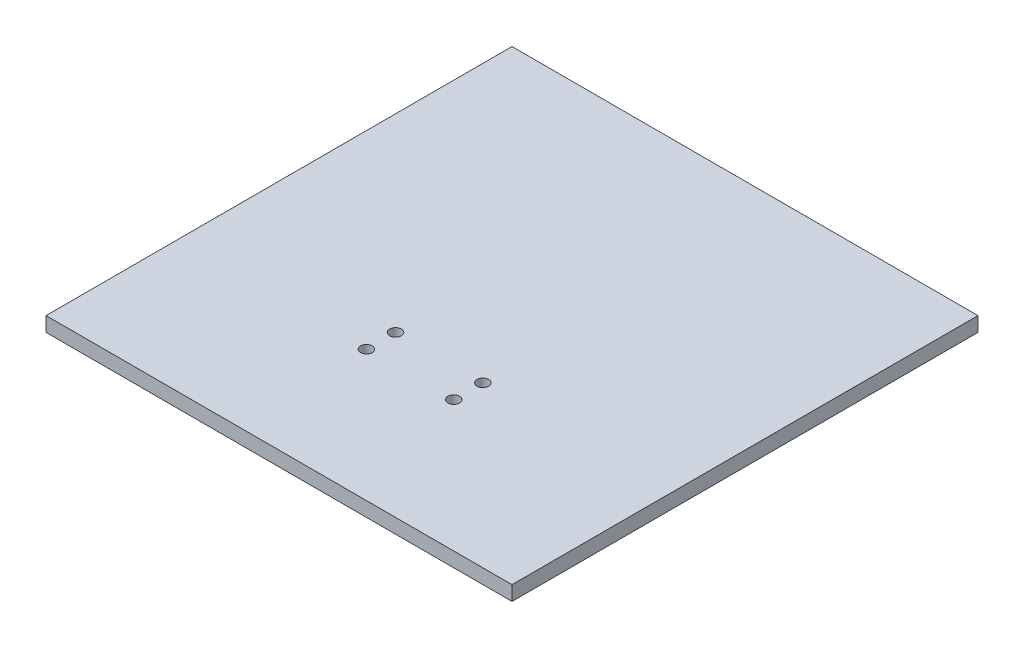
ISO-10303-21;
HEADER;
FILE_DESCRIPTION(('STEP AP214'),'2;1');
FILE_NAME('part.step','',(''),(''),'','','');
FILE_SCHEMA(('AUTOMOTIVE_DESIGN { 1 0 10303 214 1 1 1 1 }'));
ENDSEC;
DATA;
#1=APPLICATION_CONTEXT('core data for automotive mechanical design processes');
#2=APPLICATION_PROTOCOL_DEFINITION('international standard','automotive_design',2000,#1);
#3=PRODUCT_CONTEXT('',#1,'mechanical');
#4=PRODUCT('Part','Part','',(#3));
#5=PRODUCT_RELATED_PRODUCT_CATEGORY('part','',(#4));
#6=PRODUCT_DEFINITION_FORMATION('','',#4);
#7=PRODUCT_DEFINITION_CONTEXT('part definition',#1,'design');
#8=PRODUCT_DEFINITION('design','',#6,#7);
#9=PRODUCT_DEFINITION_SHAPE('','',#8);
#10=(LENGTH_UNIT() NAMED_UNIT(*) SI_UNIT(.MILLI.,.METRE.));
#11=(NAMED_UNIT(*) PLANE_ANGLE_UNIT() SI_UNIT($,.RADIAN.));
#12=(NAMED_UNIT(*) SI_UNIT($,.STERADIAN.) SOLID_ANGLE_UNIT());
#13=UNCERTAINTY_MEASURE_WITH_UNIT(LENGTH_MEASURE(1.E-05),#10,'distance_accuracy_value','');
#14=(GEOMETRIC_REPRESENTATION_CONTEXT(3) GLOBAL_UNCERTAINTY_ASSIGNED_CONTEXT((#13)) GLOBAL_UNIT_ASSIGNED_CONTEXT((#10,
#11,#12)) REPRESENTATION_CONTEXT('',''));
#15=CARTESIAN_POINT('',(0.,0.,0.));
#16=DIRECTION('',(0.,0.,1.));
#17=DIRECTION('',(1.,0.,0.));
#18=AXIS2_PLACEMENT_3D('',#15,#16,#17);
#19=CARTESIAN_POINT('',(0.,6.35,0.));
#20=DIRECTION('',(1.,0.,0.));
#21=DIRECTION('',(0.,0.,-1.));
#22=AXIS2_PLACEMENT_3D('',#19,#20,#21);
#23=PLANE('',#22);
#24=DIRECTION('',(0.,0.,1.));
#25=VECTOR('',#24,1.);
#26=CARTESIAN_POINT('',(0.,0.,0.));
#27=LINE('',#26,#25);
#28=CARTESIAN_POINT('',(0.,0.,-203.2));
#29=VERTEX_POINT('',#28);
#30=CARTESIAN_POINT('',(0.,0.,0.));
#31=VERTEX_POINT('',#30);
#32=EDGE_CURVE('E95',#29,#31,#27,.T.);
#33=ORIENTED_EDGE('',*,*,#32,.T.);
#34=DIRECTION('',(0.,-1.,0.));
#35=VECTOR('',#34,1.);
#36=CARTESIAN_POINT('',(0.,6.35,0.));
#37=LINE('',#36,#35);
#38=CARTESIAN_POINT('',(0.,6.35,0.));
#39=VERTEX_POINT('',#38);
#40=EDGE_CURVE('E11',#39,#31,#37,.T.);
#41=ORIENTED_EDGE('',*,*,#40,.F.);
#42=DIRECTION('',(0.,0.,1.));
#43=VECTOR('',#42,1.);
#44=CARTESIAN_POINT('',(0.,6.35,0.));
#45=LINE('',#44,#43);
#46=CARTESIAN_POINT('',(0.,6.35,-203.2));
#47=VERTEX_POINT('',#46);
#48=EDGE_CURVE('E83',#47,#39,#45,.T.);
#49=ORIENTED_EDGE('',*,*,#48,.F.);
#50=DIRECTION('',(0.,-1.,0.));
#51=VECTOR('',#50,1.);
#52=CARTESIAN_POINT('',(0.,6.35,-203.2));
#53=LINE('',#52,#51);
#54=EDGE_CURVE('E91',#47,#29,#53,.T.);
#55=ORIENTED_EDGE('',*,*,#54,.T.);
#56=EDGE_LOOP('',(#33,#41,#49,#55));
#57=FACE_BOUND('',#56,.T.);
#58=ADVANCED_FACE('F32',(#57),#23,.F.);
#59=CARTESIAN_POINT('',(0.,6.35,0.));
#60=DIRECTION('',(0.,0.,-1.));
#61=DIRECTION('',(-1.,0.,0.));
#62=AXIS2_PLACEMENT_3D('',#59,#60,#61);
#63=PLANE('',#62);
#64=DIRECTION('',(1.,0.,0.));
#65=VECTOR('',#64,1.);
#66=CARTESIAN_POINT('',(0.,0.,0.));
#67=LINE('',#66,#65);
#68=CARTESIAN_POINT('',(203.2,0.,0.));
#69=VERTEX_POINT('',#68);
#70=EDGE_CURVE('E87',#31,#69,#67,.T.);
#71=ORIENTED_EDGE('',*,*,#70,.T.);
#72=DIRECTION('',(0.,-1.,0.));
#73=VECTOR('',#72,1.);
#74=CARTESIAN_POINT('',(203.2,6.35,0.));
#75=LINE('',#74,#73);
#76=CARTESIAN_POINT('',(203.2,6.35,0.));
#77=VERTEX_POINT('',#76);
#78=EDGE_CURVE('E40',#77,#69,#75,.T.);
#79=ORIENTED_EDGE('',*,*,#78,.F.);
#80=DIRECTION('',(1.,0.,0.));
#81=VECTOR('',#80,1.);
#82=CARTESIAN_POINT('',(0.,6.35,0.));
#83=LINE('',#82,#81);
#84=EDGE_CURVE('E78',#39,#77,#83,.T.);
#85=ORIENTED_EDGE('',*,*,#84,.F.);
#86=ORIENTED_EDGE('',*,*,#40,.T.);
#87=EDGE_LOOP('',(#71,#79,#85,#86));
#88=FACE_BOUND('',#87,.T.);
#89=ADVANCED_FACE('F86',(#88),#63,.F.);
#90=CARTESIAN_POINT('',(203.2,6.35,0.));
#91=DIRECTION('',(-1.,0.,0.));
#92=DIRECTION('',(0.,0.,1.));
#93=AXIS2_PLACEMENT_3D('',#90,#91,#92);
#94=PLANE('',#93);
#95=DIRECTION('',(0.,0.,-1.));
#96=VECTOR('',#95,1.);
#97=CARTESIAN_POINT('',(203.2,0.,0.));
#98=LINE('',#97,#96);
#99=CARTESIAN_POINT('',(203.2,0.,-203.2));
#100=VERTEX_POINT('',#99);
#101=EDGE_CURVE('E65',#69,#100,#98,.T.);
#102=ORIENTED_EDGE('',*,*,#101,.T.);
#103=DIRECTION('',(0.,-1.,0.));
#104=VECTOR('',#103,1.);
#105=CARTESIAN_POINT('',(203.2,6.35,-203.2));
#106=LINE('',#105,#104);
#107=CARTESIAN_POINT('',(203.2,6.35,-203.2));
#108=VERTEX_POINT('',#107);
#109=EDGE_CURVE('E88',#108,#100,#106,.T.);
#110=ORIENTED_EDGE('',*,*,#109,.F.);
#111=DIRECTION('',(0.,0.,-1.));
#112=VECTOR('',#111,1.);
#113=CARTESIAN_POINT('',(203.2,6.35,0.));
#114=LINE('',#113,#112);
#115=EDGE_CURVE('E81',#77,#108,#114,.T.);
#116=ORIENTED_EDGE('',*,*,#115,.F.);
#117=ORIENTED_EDGE('',*,*,#78,.T.);
#118=EDGE_LOOP('',(#102,#110,#116,#117));
#119=FACE_BOUND('',#118,.T.);
#120=ADVANCED_FACE('F89',(#119),#94,.F.);
#121=CARTESIAN_POINT('',(0.,6.35,-203.2));
#122=DIRECTION('',(0.,0.,1.));
#123=DIRECTION('',(1.,0.,0.));
#124=AXIS2_PLACEMENT_3D('',#121,#122,#123);
#125=PLANE('',#124);
#126=DIRECTION('',(-1.,0.,0.));
#127=VECTOR('',#126,1.);
#128=CARTESIAN_POINT('',(0.,0.,-203.2));
#129=LINE('',#128,#127);
#130=EDGE_CURVE('E71',#100,#29,#129,.T.);
#131=ORIENTED_EDGE('',*,*,#130,.T.);
#132=ORIENTED_EDGE('',*,*,#54,.F.);
#133=DIRECTION('',(-1.,0.,0.));
#134=VECTOR('',#133,1.);
#135=CARTESIAN_POINT('',(0.,6.35,-203.2));
#136=LINE('',#135,#134);
#137=EDGE_CURVE('E48',#108,#47,#136,.T.);
#138=ORIENTED_EDGE('',*,*,#137,.F.);
#139=ORIENTED_EDGE('',*,*,#109,.T.);
#140=EDGE_LOOP('',(#131,#132,#138,#139));
#141=FACE_BOUND('',#140,.T.);
#142=ADVANCED_FACE('F103',(#141),#125,.F.);
#143=CARTESIAN_POINT('',(0.,6.35,0.));
#144=DIRECTION('',(0.,-1.,0.));
#145=DIRECTION('',(0.,0.,-1.));
#146=AXIS2_PLACEMENT_3D('',#143,#144,#145);
#147=PLANE('',#146);
#148=CARTESIAN_POINT('',(82.55,6.35,-57.15));
#149=DIRECTION('',(0.,-1.,0.));
#150=DIRECTION('',(0.,0.,-1.));
#151=AXIS2_PLACEMENT_3D('',#148,#149,#150);
#152=CIRCLE('',#151,2.55269999999999);
#153=CARTESIAN_POINT('',(82.55,6.35,-59.7027));
#154=VERTEX_POINT('',#153);
#155=EDGE_CURVE('E135',#154,#154,#152,.T.);
#156=ORIENTED_EDGE('',*,*,#155,.T.);
#157=EDGE_LOOP('',(#156));
#158=FACE_BOUND('',#157,.T.);
#159=CARTESIAN_POINT('',(82.55,6.35,-69.85));
#160=DIRECTION('',(0.,-1.,0.));
#161=DIRECTION('',(0.,0.,-1.));
#162=AXIS2_PLACEMENT_3D('',#159,#160,#161);
#163=CIRCLE('',#162,2.55269999999999);
#164=CARTESIAN_POINT('',(82.55,6.35,-72.4027));
#165=VERTEX_POINT('',#164);
#166=EDGE_CURVE('E126',#165,#165,#163,.T.);
#167=ORIENTED_EDGE('',*,*,#166,.T.);
#168=EDGE_LOOP('',(#167));
#169=FACE_BOUND('',#168,.T.);
#170=CARTESIAN_POINT('',(120.65,6.35,-57.15));
#171=DIRECTION('',(0.,-1.,0.));
#172=DIRECTION('',(0.,0.,-1.));
#173=AXIS2_PLACEMENT_3D('',#170,#171,#172);
#174=CIRCLE('',#173,2.55269999999999);
#175=CARTESIAN_POINT('',(120.65,6.35,-59.7027));
#176=VERTEX_POINT('',#175);
#177=EDGE_CURVE('E117',#176,#176,#174,.T.);
#178=ORIENTED_EDGE('',*,*,#177,.T.);
#179=EDGE_LOOP('',(#178));
#180=FACE_BOUND('',#179,.T.);
#181=CARTESIAN_POINT('',(120.65,6.35,-69.85));
#182=DIRECTION('',(0.,-1.,0.));
#183=DIRECTION('',(0.,0.,-1.));
#184=AXIS2_PLACEMENT_3D('',#181,#182,#183);
#185=CIRCLE('',#184,2.55269999999999);
#186=CARTESIAN_POINT('',(120.65,6.35,-72.4027));
#187=VERTEX_POINT('',#186);
#188=EDGE_CURVE('E98',#187,#187,#185,.T.);
#189=ORIENTED_EDGE('',*,*,#188,.T.);
#190=EDGE_LOOP('',(#189));
#191=FACE_BOUND('',#190,.T.);
#192=ORIENTED_EDGE('',*,*,#48,.T.);
#193=ORIENTED_EDGE('',*,*,#84,.T.);
#194=ORIENTED_EDGE('',*,*,#115,.T.);
#195=ORIENTED_EDGE('',*,*,#137,.T.);
#196=EDGE_LOOP('',(#192,#193,#194,#195));
#197=FACE_BOUND('',#196,.T.);
#198=ADVANCED_FACE('F79',(#158,#169,#180,#191,#197),#147,.F.);
#199=CARTESIAN_POINT('',(0.,0.,0.));
#200=DIRECTION('',(0.,-1.,0.));
#201=DIRECTION('',(0.,0.,-1.));
#202=AXIS2_PLACEMENT_3D('',#199,#200,#201);
#203=PLANE('',#202);
#204=CARTESIAN_POINT('',(82.55,0.,-57.15));
#205=DIRECTION('',(0.,-1.,0.));
#206=DIRECTION('',(0.,0.,-1.));
#207=AXIS2_PLACEMENT_3D('',#204,#205,#206);
#208=CIRCLE('',#207,4.88950000000001);
#209=CARTESIAN_POINT('',(82.55,0.,-62.0395000000001));
#210=VERTEX_POINT('',#209);
#211=EDGE_CURVE('E141',#210,#210,#208,.T.);
#212=ORIENTED_EDGE('',*,*,#211,.F.);
#213=EDGE_LOOP('',(#212));
#214=FACE_BOUND('',#213,.T.);
#215=CARTESIAN_POINT('',(82.55,0.,-69.85));
#216=DIRECTION('',(0.,-1.,0.));
#217=DIRECTION('',(0.,0.,-1.));
#218=AXIS2_PLACEMENT_3D('',#215,#216,#217);
#219=CIRCLE('',#218,4.88950000000001);
#220=CARTESIAN_POINT('',(82.55,0.,-74.7395));
#221=VERTEX_POINT('',#220);
#222=EDGE_CURVE('E132',#221,#221,#219,.T.);
#223=ORIENTED_EDGE('',*,*,#222,.F.);
#224=EDGE_LOOP('',(#223));
#225=FACE_BOUND('',#224,.T.);
#226=CARTESIAN_POINT('',(120.65,0.,-57.15));
#227=DIRECTION('',(0.,-1.,0.));
#228=DIRECTION('',(0.,0.,-1.));
#229=AXIS2_PLACEMENT_3D('',#226,#227,#228);
#230=CIRCLE('',#229,4.88949999999999);
#231=CARTESIAN_POINT('',(120.65,0.,-62.0395));
#232=VERTEX_POINT('',#231);
#233=EDGE_CURVE('E123',#232,#232,#230,.T.);
#234=ORIENTED_EDGE('',*,*,#233,.F.);
#235=EDGE_LOOP('',(#234));
#236=FACE_BOUND('',#235,.T.);
#237=CARTESIAN_POINT('',(120.65,0.,-69.85));
#238=DIRECTION('',(0.,-1.,0.));
#239=DIRECTION('',(0.,0.,-1.));
#240=AXIS2_PLACEMENT_3D('',#237,#238,#239);
#241=CIRCLE('',#240,4.88949999999999);
#242=CARTESIAN_POINT('',(120.65,0.,-74.7395));
#243=VERTEX_POINT('',#242);
#244=EDGE_CURVE('E114',#243,#243,#241,.T.);
#245=ORIENTED_EDGE('',*,*,#244,.F.);
#246=EDGE_LOOP('',(#245));
#247=FACE_BOUND('',#246,.T.);
#248=ORIENTED_EDGE('',*,*,#32,.F.);
#249=ORIENTED_EDGE('',*,*,#130,.F.);
#250=ORIENTED_EDGE('',*,*,#101,.F.);
#251=ORIENTED_EDGE('',*,*,#70,.F.);
#252=EDGE_LOOP('',(#248,#249,#250,#251));
#253=FACE_BOUND('',#252,.T.);
#254=ADVANCED_FACE('F106',(#214,#225,#236,#247,#253),#203,.T.);
#255=CARTESIAN_POINT('',(120.65,0.,-69.85));
#256=DIRECTION('',(0.,-1.,0.));
#257=DIRECTION('',(0.,0.,-1.));
#258=AXIS2_PLACEMENT_3D('',#255,#256,#257);
#259=CYLINDRICAL_SURFACE('',#258,2.5527);
#260=ORIENTED_EDGE('',*,*,#188,.F.);
#261=EDGE_LOOP('',(#260));
#262=FACE_BOUND('',#261,.T.);
#263=CARTESIAN_POINT('',(120.65,1.96080801813507,-69.85));
#264=DIRECTION('',(0.,-1.,0.));
#265=DIRECTION('',(0.,0.,-1.));
#266=AXIS2_PLACEMENT_3D('',#263,#264,#265);
#267=CIRCLE('',#266,2.55270000000001);
#268=CARTESIAN_POINT('',(120.65,1.96080801813507,-72.4027));
#269=VERTEX_POINT('',#268);
#270=EDGE_CURVE('E111',#269,#269,#267,.T.);
#271=ORIENTED_EDGE('',*,*,#270,.T.);
#272=EDGE_LOOP('',(#271));
#273=FACE_BOUND('',#272,.T.);
#274=ADVANCED_FACE('F149',(#262,#273),#259,.F.);
#275=CARTESIAN_POINT('',(120.65,0.,-69.85));
#276=DIRECTION('',(0.,-1.,0.));
#277=DIRECTION('',(0.,0.,-1.));
#278=AXIS2_PLACEMENT_3D('',#275,#276,#277);
#279=CONICAL_SURFACE('',#278,4.88949999999999,0.872664625997161);
#280=ORIENTED_EDGE('',*,*,#270,.F.);
#281=EDGE_LOOP('',(#280));
#282=FACE_BOUND('',#281,.T.);
#283=ORIENTED_EDGE('',*,*,#244,.T.);
#284=EDGE_LOOP('',(#283));
#285=FACE_BOUND('',#284,.T.);
#286=ADVANCED_FACE('F157',(#282,#285),#279,.F.);
#287=CARTESIAN_POINT('',(120.65,0.,-57.15));
#288=DIRECTION('',(0.,-1.,0.));
#289=DIRECTION('',(0.,0.,-1.));
#290=AXIS2_PLACEMENT_3D('',#287,#288,#289);
#291=CYLINDRICAL_SURFACE('',#290,2.5527);
#292=ORIENTED_EDGE('',*,*,#177,.F.);
#293=EDGE_LOOP('',(#292));
#294=FACE_BOUND('',#293,.T.);
#295=CARTESIAN_POINT('',(120.65,1.96080801813507,-57.15));
#296=DIRECTION('',(0.,-1.,0.));
#297=DIRECTION('',(0.,0.,-1.));
#298=AXIS2_PLACEMENT_3D('',#295,#296,#297);
#299=CIRCLE('',#298,2.55270000000001);
#300=CARTESIAN_POINT('',(120.65,1.96080801813507,-59.7027));
#301=VERTEX_POINT('',#300);
#302=EDGE_CURVE('E120',#301,#301,#299,.T.);
#303=ORIENTED_EDGE('',*,*,#302,.T.);
#304=EDGE_LOOP('',(#303));
#305=FACE_BOUND('',#304,.T.);
#306=ADVANCED_FACE('F159',(#294,#305),#291,.F.);
#307=CARTESIAN_POINT('',(120.65,0.,-57.15));
#308=DIRECTION('',(0.,-1.,0.));
#309=DIRECTION('',(0.,0.,-1.));
#310=AXIS2_PLACEMENT_3D('',#307,#308,#309);
#311=CONICAL_SURFACE('',#310,4.88949999999999,0.872664625997161);
#312=ORIENTED_EDGE('',*,*,#302,.F.);
#313=EDGE_LOOP('',(#312));
#314=FACE_BOUND('',#313,.T.);
#315=ORIENTED_EDGE('',*,*,#233,.T.);
#316=EDGE_LOOP('',(#315));
#317=FACE_BOUND('',#316,.T.);
#318=ADVANCED_FACE('F166',(#314,#317),#311,.F.);
#319=CARTESIAN_POINT('',(82.55,0.,-69.85));
#320=DIRECTION('',(0.,-1.,0.));
#321=DIRECTION('',(0.,0.,-1.));
#322=AXIS2_PLACEMENT_3D('',#319,#320,#321);
#323=CYLINDRICAL_SURFACE('',#322,2.5527);
#324=ORIENTED_EDGE('',*,*,#166,.F.);
#325=EDGE_LOOP('',(#324));
#326=FACE_BOUND('',#325,.T.);
#327=CARTESIAN_POINT('',(82.55,1.96080801813507,-69.85));
#328=DIRECTION('',(0.,-1.,0.));
#329=DIRECTION('',(0.,0.,-1.));
#330=AXIS2_PLACEMENT_3D('',#327,#328,#329);
#331=CIRCLE('',#330,2.55270000000001);
#332=CARTESIAN_POINT('',(82.55,1.96080801813507,-72.4027));
#333=VERTEX_POINT('',#332);
#334=EDGE_CURVE('E129',#333,#333,#331,.T.);
#335=ORIENTED_EDGE('',*,*,#334,.T.);
#336=EDGE_LOOP('',(#335));
#337=FACE_BOUND('',#336,.T.);
#338=ADVANCED_FACE('F200',(#326,#337),#323,.F.);
#339=CARTESIAN_POINT('',(82.55,0.,-69.85));
#340=DIRECTION('',(0.,-1.,0.));
#341=DIRECTION('',(0.,0.,-1.));
#342=AXIS2_PLACEMENT_3D('',#339,#340,#341);
#343=CONICAL_SURFACE('',#342,4.88950000000001,0.872664625997164);
#344=ORIENTED_EDGE('',*,*,#334,.F.);
#345=EDGE_LOOP('',(#344));
#346=FACE_BOUND('',#345,.T.);
#347=ORIENTED_EDGE('',*,*,#222,.T.);
#348=EDGE_LOOP('',(#347));
#349=FACE_BOUND('',#348,.T.);
#350=ADVANCED_FACE('F205',(#346,#349),#343,.F.);
#351=CARTESIAN_POINT('',(82.55,0.,-57.15));
#352=DIRECTION('',(0.,-1.,0.));
#353=DIRECTION('',(0.,0.,-1.));
#354=AXIS2_PLACEMENT_3D('',#351,#352,#353);
#355=CYLINDRICAL_SURFACE('',#354,2.5527);
#356=ORIENTED_EDGE('',*,*,#155,.F.);
#357=EDGE_LOOP('',(#356));
#358=FACE_BOUND('',#357,.T.);
#359=CARTESIAN_POINT('',(82.55,1.96080801813507,-57.15));
#360=DIRECTION('',(0.,-1.,0.));
#361=DIRECTION('',(0.,0.,-1.));
#362=AXIS2_PLACEMENT_3D('',#359,#360,#361);
#363=CIRCLE('',#362,2.55270000000001);
#364=CARTESIAN_POINT('',(82.55,1.96080801813507,-59.7027));
#365=VERTEX_POINT('',#364);
#366=EDGE_CURVE('E138',#365,#365,#363,.T.);
#367=ORIENTED_EDGE('',*,*,#366,.T.);
#368=EDGE_LOOP('',(#367));
#369=FACE_BOUND('',#368,.T.);
#370=ADVANCED_FACE('F211',(#358,#369),#355,.F.);
#371=CARTESIAN_POINT('',(82.55,0.,-57.15));
#372=DIRECTION('',(0.,-1.,0.));
#373=DIRECTION('',(0.,0.,-1.));
#374=AXIS2_PLACEMENT_3D('',#371,#372,#373);
#375=CONICAL_SURFACE('',#374,4.88950000000001,0.872664625997164);
#376=ORIENTED_EDGE('',*,*,#366,.F.);
#377=EDGE_LOOP('',(#376));
#378=FACE_BOUND('',#377,.T.);
#379=ORIENTED_EDGE('',*,*,#211,.T.);
#380=EDGE_LOOP('',(#379));
#381=FACE_BOUND('',#380,.T.);
#382=ADVANCED_FACE('F145',(#378,#381),#375,.F.);
#383=CLOSED_SHELL('',(#58,#89,#120,#142,#198,#254,#274,#286,#306,#318,#338,#350,#370,#382));
#384=MANIFOLD_SOLID_BREP('B2',#383);
#385=ADVANCED_BREP_SHAPE_REPRESENTATION('',(#18,#384),#14);
#386=SHAPE_DEFINITION_REPRESENTATION(#9,#385);
ENDSEC;
END-ISO-10303-21;
